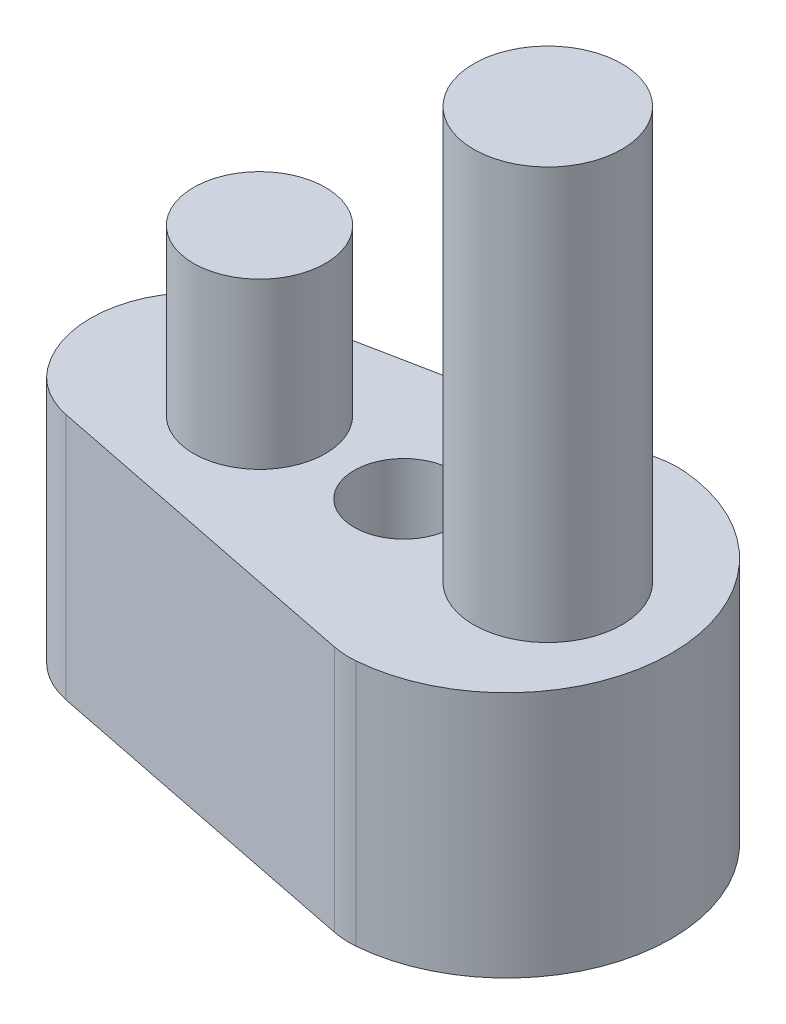
ISO-10303-21;
HEADER;
FILE_DESCRIPTION(('STEP AP214'),'2;1');
FILE_NAME('part.step','',(''),(''),'','','');
FILE_SCHEMA(('AUTOMOTIVE_DESIGN { 1 0 10303 214 1 1 1 1 }'));
ENDSEC;
DATA;
#1=APPLICATION_CONTEXT('core data for automotive mechanical design processes');
#2=APPLICATION_PROTOCOL_DEFINITION('international standard','automotive_design',2000,#1);
#3=PRODUCT_CONTEXT('',#1,'mechanical');
#4=PRODUCT('Part','Part','',(#3));
#5=PRODUCT_RELATED_PRODUCT_CATEGORY('part','',(#4));
#6=PRODUCT_DEFINITION_FORMATION('','',#4);
#7=PRODUCT_DEFINITION_CONTEXT('part definition',#1,'design');
#8=PRODUCT_DEFINITION('design','',#6,#7);
#9=PRODUCT_DEFINITION_SHAPE('','',#8);
#10=(LENGTH_UNIT() NAMED_UNIT(*) SI_UNIT(.MILLI.,.METRE.));
#11=(NAMED_UNIT(*) PLANE_ANGLE_UNIT() SI_UNIT($,.RADIAN.));
#12=(NAMED_UNIT(*) SI_UNIT($,.STERADIAN.) SOLID_ANGLE_UNIT());
#13=UNCERTAINTY_MEASURE_WITH_UNIT(LENGTH_MEASURE(1.E-05),#10,'distance_accuracy_value','');
#14=(GEOMETRIC_REPRESENTATION_CONTEXT(3) GLOBAL_UNCERTAINTY_ASSIGNED_CONTEXT((#13)) GLOBAL_UNIT_ASSIGNED_CONTEXT((#10,
#11,#12)) REPRESENTATION_CONTEXT('',''));
#15=CARTESIAN_POINT('',(0.,0.,0.));
#16=DIRECTION('',(0.,0.,1.));
#17=DIRECTION('',(1.,0.,0.));
#18=AXIS2_PLACEMENT_3D('',#15,#16,#17);
#19=CARTESIAN_POINT('',(0.,3.,0.));
#20=DIRECTION('',(0.,1.,0.));
#21=DIRECTION('',(0.,0.,1.));
#22=AXIS2_PLACEMENT_3D('',#19,#20,#21);
#23=PLANE('',#22);
#24=CARTESIAN_POINT('',(0.5,3.,0.));
#25=DIRECTION('',(0.,1.,0.));
#26=DIRECTION('',(0.,0.,1.));
#27=AXIS2_PLACEMENT_3D('',#24,#25,#26);
#28=CIRCLE('',#27,0.9);
#29=CARTESIAN_POINT('',(0.5,3.,0.9));
#30=VERTEX_POINT('',#29);
#31=EDGE_CURVE('E138',#30,#30,#28,.F.);
#32=ORIENTED_EDGE('',*,*,#31,.T.);
#33=EDGE_LOOP('',(#32));
#34=FACE_BOUND('',#33,.T.);
#35=CARTESIAN_POINT('',(-3.9873014814638,3.,0.183542929297438));
#36=DIRECTION('',(0.,1.,0.));
#37=DIRECTION('',(0.,0.,1.));
#38=AXIS2_PLACEMENT_3D('',#35,#36,#37);
#39=CIRCLE('',#38,1.);
#40=CARTESIAN_POINT('',(-4.183235690524,3.,1.16415997265328));
#41=VERTEX_POINT('',#40);
#42=CARTESIAN_POINT('',(-4.77830641967648,3.,0.795352693622231));
#43=VERTEX_POINT('',#42);
#44=EDGE_CURVE('E156',#41,#43,#39,.F.);
#45=ORIENTED_EDGE('',*,*,#44,.F.);
#46=DIRECTION('',(-0.980617043355843,0.,-0.195934209060197));
#47=VECTOR('',#46,1.);
#48=CARTESIAN_POINT('',(-0.384272849561752,3.,1.92321957143991));
#49=LINE('',#48,#47);
#50=CARTESIAN_POINT('',(-0.113883759971435,3.,1.97724522066388));
#51=VERTEX_POINT('',#50);
#52=EDGE_CURVE('E179',#51,#41,#49,.T.);
#53=ORIENTED_EDGE('',*,*,#52,.F.);
#54=CARTESIAN_POINT('',(0.0820504490887623,3.,0.996628177308034));
#55=DIRECTION('',(0.,1.,0.));
#56=DIRECTION('',(0.,0.,1.));
#57=AXIS2_PLACEMENT_3D('',#54,#55,#56);
#58=CIRCLE('',#57,1.);
#59=CARTESIAN_POINT('',(0.164100898177525,3.,1.99325635461607));
#60=VERTEX_POINT('',#59);
#61=EDGE_CURVE('E168',#51,#60,#58,.T.);
#62=ORIENTED_EDGE('',*,*,#61,.T.);
#63=CARTESIAN_POINT('',(-1.05819487287301E-11,3.,-1.28546370596616E-10));
#64=DIRECTION('',(0.,1.,0.));
#65=DIRECTION('',(0.,0.,1.));
#66=AXIS2_PLACEMENT_3D('',#63,#64,#65);
#67=CIRCLE('',#66,2.00000000012898);
#68=CARTESIAN_POINT('',(0.164100899999999,3.,-1.99325635472312));
#69=VERTEX_POINT('',#68);
#70=EDGE_CURVE('E189',#69,#60,#67,.F.);
#71=ORIENTED_EDGE('',*,*,#70,.F.);
#72=CARTESIAN_POINT('',(0.0820504499999999,3.,-0.996628177490106));
#73=DIRECTION('',(0.,1.,0.));
#74=DIRECTION('',(0.,0.,1.));
#75=AXIS2_PLACEMENT_3D('',#72,#73,#74);
#76=CIRCLE('',#75,1.);
#77=CARTESIAN_POINT('',(-0.113883759060197,3.,-1.97724522084595));
#78=VERTEX_POINT('',#77);
#79=EDGE_CURVE('E114',#69,#78,#76,.T.);
#80=ORIENTED_EDGE('',*,*,#79,.T.);
#81=DIRECTION('',(-0.980617043355843,0.,0.195934209060197));
#82=VECTOR('',#81,1.);
#83=CARTESIAN_POINT('',(-0.384272849561752,3.,-1.92321957143991));
#84=LINE('',#83,#82);
#85=CARTESIAN_POINT('',(-4.183235690524,3.,-1.16415997265328));
#86=VERTEX_POINT('',#85);
#87=EDGE_CURVE('E107',#78,#86,#84,.T.);
#88=ORIENTED_EDGE('',*,*,#87,.T.);
#89=CARTESIAN_POINT('',(-3.9873014814638,3.,-0.183542929297438));
#90=DIRECTION('',(0.,1.,0.));
#91=DIRECTION('',(0.,0.,1.));
#92=AXIS2_PLACEMENT_3D('',#89,#90,#91);
#93=CIRCLE('',#92,1.);
#94=CARTESIAN_POINT('',(-4.77830641967648,3.,-0.795352693622231));
#95=VERTEX_POINT('',#94);
#96=EDGE_CURVE('E111',#86,#95,#93,.T.);
#97=ORIENTED_EDGE('',*,*,#96,.T.);
#98=CARTESIAN_POINT('',(-3.75,3.,0.));
#99=DIRECTION('',(0.,1.,0.));
#100=DIRECTION('',(0.,0.,1.));
#101=AXIS2_PLACEMENT_3D('',#98,#99,#100);
#102=CIRCLE('',#101,1.3);
#103=EDGE_CURVE('E54',#95,#43,#102,.T.);
#104=ORIENTED_EDGE('',*,*,#103,.T.);
#105=EDGE_LOOP('',(#45,#53,#62,#71,#80,#88,#97,#104));
#106=FACE_BOUND('',#105,.T.);
#107=CARTESIAN_POINT('',(-1.24999999999968,3.,0.));
#108=DIRECTION('',(0.,1.,0.));
#109=DIRECTION('',(0.,0.,1.));
#110=AXIS2_PLACEMENT_3D('',#107,#108,#109);
#111=CIRCLE('',#110,0.6);
#112=CARTESIAN_POINT('',(-1.24999999999968,3.,0.599999999999994));
#113=VERTEX_POINT('',#112);
#114=EDGE_CURVE('E128',#113,#113,#111,.T.);
#115=ORIENTED_EDGE('',*,*,#114,.F.);
#116=EDGE_LOOP('',(#115));
#117=FACE_BOUND('',#116,.T.);
#118=CARTESIAN_POINT('',(-3.,3.,0.));
#119=DIRECTION('',(0.,1.,0.));
#120=DIRECTION('',(0.,0.,1.));
#121=AXIS2_PLACEMENT_3D('',#118,#119,#120);
#122=CIRCLE('',#121,0.8);
#123=CARTESIAN_POINT('',(-3.,3.,0.8));
#124=VERTEX_POINT('',#123);
#125=EDGE_CURVE('E337',#124,#124,#122,.F.);
#126=ORIENTED_EDGE('',*,*,#125,.T.);
#127=EDGE_LOOP('',(#126));
#128=FACE_BOUND('',#127,.T.);
#129=ADVANCED_FACE('F37',(#34,#106,#117,#128),#23,.T.);
#130=CARTESIAN_POINT('',(-3.9873014814638,3.,0.183542929297438));
#131=DIRECTION('',(0.,-1.,0.));
#132=DIRECTION('',(0.,0.,-1.));
#133=AXIS2_PLACEMENT_3D('',#130,#131,#132);
#134=CYLINDRICAL_SURFACE('',#133,1.);
#135=CARTESIAN_POINT('',(-3.9873014814638,0.,0.183542929297438));
#136=DIRECTION('',(0.,1.,0.));
#137=DIRECTION('',(0.,0.,1.));
#138=AXIS2_PLACEMENT_3D('',#135,#136,#137);
#139=CIRCLE('',#138,1.);
#140=CARTESIAN_POINT('',(-4.183235690524,0.,1.16415997265328));
#141=VERTEX_POINT('',#140);
#142=CARTESIAN_POINT('',(-4.77830641967648,0.,0.795352693622231));
#143=VERTEX_POINT('',#142);
#144=EDGE_CURVE('E134',#141,#143,#139,.F.);
#145=ORIENTED_EDGE('',*,*,#144,.F.);
#146=DIRECTION('',(0.,-1.,0.));
#147=VECTOR('',#146,1.);
#148=CARTESIAN_POINT('',(-4.183235690524,3.,1.16415997265328));
#149=LINE('',#148,#147);
#150=EDGE_CURVE('E11',#41,#141,#149,.T.);
#151=ORIENTED_EDGE('',*,*,#150,.F.);
#152=ORIENTED_EDGE('',*,*,#44,.T.);
#153=DIRECTION('',(0.,-1.,0.));
#154=VECTOR('',#153,1.);
#155=CARTESIAN_POINT('',(-4.77830641967648,3.,0.795352693622231));
#156=LINE('',#155,#154);
#157=EDGE_CURVE('E89',#43,#143,#156,.T.);
#158=ORIENTED_EDGE('',*,*,#157,.T.);
#159=EDGE_LOOP('',(#145,#151,#152,#158));
#160=FACE_BOUND('',#159,.T.);
#161=ADVANCED_FACE('F39',(#160),#134,.T.);
#162=CARTESIAN_POINT('',(-0.384272849561752,3.,1.92321957143991));
#163=DIRECTION('',(-0.195934209060197,0.,0.980617043355843));
#164=DIRECTION('',(0.980617043355843,0.,0.195934209060197));
#165=AXIS2_PLACEMENT_3D('',#162,#163,#164);
#166=PLANE('',#165);
#167=DIRECTION('',(-0.980617043355843,0.,-0.195934209060197));
#168=VECTOR('',#167,1.);
#169=CARTESIAN_POINT('',(-0.384272849561752,0.,1.92321957143991));
#170=LINE('',#169,#168);
#171=CARTESIAN_POINT('',(-0.113883759971435,0.,1.97724522066388));
#172=VERTEX_POINT('',#171);
#173=EDGE_CURVE('E137',#172,#141,#170,.T.);
#174=ORIENTED_EDGE('',*,*,#173,.F.);
#175=DIRECTION('',(0.,-1.,0.));
#176=VECTOR('',#175,1.);
#177=CARTESIAN_POINT('',(-0.113883759971435,3.,1.97724522066388));
#178=LINE('',#177,#176);
#179=EDGE_CURVE('E46',#51,#172,#178,.T.);
#180=ORIENTED_EDGE('',*,*,#179,.F.);
#181=ORIENTED_EDGE('',*,*,#52,.T.);
#182=ORIENTED_EDGE('',*,*,#150,.T.);
#183=EDGE_LOOP('',(#174,#180,#181,#182));
#184=FACE_BOUND('',#183,.T.);
#185=ADVANCED_FACE('F178',(#184),#166,.T.);
#186=CARTESIAN_POINT('',(0.0820504490887623,3.,0.996628177308034));
#187=DIRECTION('',(0.,-1.,0.));
#188=DIRECTION('',(0.,0.,-1.));
#189=AXIS2_PLACEMENT_3D('',#186,#187,#188);
#190=CYLINDRICAL_SURFACE('',#189,1.);
#191=CARTESIAN_POINT('',(0.0820504490887623,0.,0.996628177308034));
#192=DIRECTION('',(0.,1.,0.));
#193=DIRECTION('',(0.,0.,1.));
#194=AXIS2_PLACEMENT_3D('',#191,#192,#193);
#195=CIRCLE('',#194,1.);
#196=CARTESIAN_POINT('',(0.164100898177525,0.,1.99325635461607));
#197=VERTEX_POINT('',#196);
#198=EDGE_CURVE('E141',#172,#197,#195,.T.);
#199=ORIENTED_EDGE('',*,*,#198,.T.);
#200=DIRECTION('',(0.,-1.,0.));
#201=VECTOR('',#200,1.);
#202=CARTESIAN_POINT('',(0.164100898177525,3.,1.99325635461607));
#203=LINE('',#202,#201);
#204=EDGE_CURVE('E162',#60,#197,#203,.T.);
#205=ORIENTED_EDGE('',*,*,#204,.F.);
#206=ORIENTED_EDGE('',*,*,#61,.F.);
#207=ORIENTED_EDGE('',*,*,#179,.T.);
#208=EDGE_LOOP('',(#199,#205,#206,#207));
#209=FACE_BOUND('',#208,.T.);
#210=ADVANCED_FACE('F166',(#209),#190,.T.);
#211=CARTESIAN_POINT('',(-1.05819487287301E-11,3.,-1.28546370596616E-10));
#212=DIRECTION('',(0.,-1.,0.));
#213=DIRECTION('',(0.,0.,-1.));
#214=AXIS2_PLACEMENT_3D('',#211,#212,#213);
#215=CYLINDRICAL_SURFACE('',#214,2.00000000012898);
#216=CARTESIAN_POINT('',(-1.05819487287301E-11,0.,-1.28546370596616E-10));
#217=DIRECTION('',(0.,1.,0.));
#218=DIRECTION('',(0.,0.,1.));
#219=AXIS2_PLACEMENT_3D('',#216,#217,#218);
#220=CIRCLE('',#219,2.00000000012898);
#221=CARTESIAN_POINT('',(0.164100899999999,0.,-1.99325635472312));
#222=VERTEX_POINT('',#221);
#223=EDGE_CURVE('E144',#222,#197,#220,.F.);
#224=ORIENTED_EDGE('',*,*,#223,.F.);
#225=DIRECTION('',(0.,-1.,0.));
#226=VECTOR('',#225,1.);
#227=CARTESIAN_POINT('',(0.164100899999999,3.,-1.99325635472312));
#228=LINE('',#227,#226);
#229=EDGE_CURVE('E160',#69,#222,#228,.T.);
#230=ORIENTED_EDGE('',*,*,#229,.F.);
#231=ORIENTED_EDGE('',*,*,#70,.T.);
#232=ORIENTED_EDGE('',*,*,#204,.T.);
#233=EDGE_LOOP('',(#224,#230,#231,#232));
#234=FACE_BOUND('',#233,.T.);
#235=ADVANCED_FACE('F192',(#234),#215,.T.);
#236=CARTESIAN_POINT('',(0.0820504499999999,3.,-0.996628177490106));
#237=DIRECTION('',(0.,-1.,0.));
#238=DIRECTION('',(0.,0.,-1.));
#239=AXIS2_PLACEMENT_3D('',#236,#237,#238);
#240=CYLINDRICAL_SURFACE('',#239,1.);
#241=CARTESIAN_POINT('',(0.0820504499999999,0.,-0.996628177490106));
#242=DIRECTION('',(0.,1.,0.));
#243=DIRECTION('',(0.,0.,1.));
#244=AXIS2_PLACEMENT_3D('',#241,#242,#243);
#245=CIRCLE('',#244,1.);
#246=CARTESIAN_POINT('',(-0.113883759060197,0.,-1.97724522084595));
#247=VERTEX_POINT('',#246);
#248=EDGE_CURVE('E147',#222,#247,#245,.T.);
#249=ORIENTED_EDGE('',*,*,#248,.T.);
#250=DIRECTION('',(0.,-1.,0.));
#251=VECTOR('',#250,1.);
#252=CARTESIAN_POINT('',(-0.113883759060197,3.,-1.97724522084595));
#253=LINE('',#252,#251);
#254=EDGE_CURVE('E123',#78,#247,#253,.T.);
#255=ORIENTED_EDGE('',*,*,#254,.F.);
#256=ORIENTED_EDGE('',*,*,#79,.F.);
#257=ORIENTED_EDGE('',*,*,#229,.T.);
#258=EDGE_LOOP('',(#249,#255,#256,#257));
#259=FACE_BOUND('',#258,.T.);
#260=ADVANCED_FACE('F194',(#259),#240,.T.);
#261=CARTESIAN_POINT('',(-0.384272849561752,3.,-1.92321957143991));
#262=DIRECTION('',(0.195934209060197,0.,0.980617043355843));
#263=DIRECTION('',(0.980617043355843,0.,-0.195934209060197));
#264=AXIS2_PLACEMENT_3D('',#261,#262,#263);
#265=PLANE('',#264);
#266=DIRECTION('',(-0.980617043355843,0.,0.195934209060197));
#267=VECTOR('',#266,1.);
#268=CARTESIAN_POINT('',(-0.384272849561752,0.,-1.92321957143991));
#269=LINE('',#268,#267);
#270=CARTESIAN_POINT('',(-4.183235690524,0.,-1.16415997265328));
#271=VERTEX_POINT('',#270);
#272=EDGE_CURVE('E122',#247,#271,#269,.T.);
#273=ORIENTED_EDGE('',*,*,#272,.T.);
#274=DIRECTION('',(0.,-1.,0.));
#275=VECTOR('',#274,1.);
#276=CARTESIAN_POINT('',(-4.183235690524,3.,-1.16415997265328));
#277=LINE('',#276,#275);
#278=EDGE_CURVE('E119',#86,#271,#277,.T.);
#279=ORIENTED_EDGE('',*,*,#278,.F.);
#280=ORIENTED_EDGE('',*,*,#87,.F.);
#281=ORIENTED_EDGE('',*,*,#254,.T.);
#282=EDGE_LOOP('',(#273,#279,#280,#281));
#283=FACE_BOUND('',#282,.T.);
#284=ADVANCED_FACE('F120',(#283),#265,.F.);
#285=CARTESIAN_POINT('',(-3.9873014814638,3.,-0.183542929297438));
#286=DIRECTION('',(0.,-1.,0.));
#287=DIRECTION('',(0.,0.,-1.));
#288=AXIS2_PLACEMENT_3D('',#285,#286,#287);
#289=CYLINDRICAL_SURFACE('',#288,1.);
#290=CARTESIAN_POINT('',(-3.9873014814638,0.,-0.183542929297438));
#291=DIRECTION('',(0.,1.,0.));
#292=DIRECTION('',(0.,0.,1.));
#293=AXIS2_PLACEMENT_3D('',#290,#291,#292);
#294=CIRCLE('',#293,1.);
#295=CARTESIAN_POINT('',(-4.77830641967648,0.,-0.795352693622231));
#296=VERTEX_POINT('',#295);
#297=EDGE_CURVE('E82',#271,#296,#294,.T.);
#298=ORIENTED_EDGE('',*,*,#297,.T.);
#299=DIRECTION('',(0.,-1.,0.));
#300=VECTOR('',#299,1.);
#301=CARTESIAN_POINT('',(-4.77830641967648,3.,-0.795352693622231));
#302=LINE('',#301,#300);
#303=EDGE_CURVE('E124',#95,#296,#302,.T.);
#304=ORIENTED_EDGE('',*,*,#303,.F.);
#305=ORIENTED_EDGE('',*,*,#96,.F.);
#306=ORIENTED_EDGE('',*,*,#278,.T.);
#307=EDGE_LOOP('',(#298,#304,#305,#306));
#308=FACE_BOUND('',#307,.T.);
#309=ADVANCED_FACE('F126',(#308),#289,.T.);
#310=CARTESIAN_POINT('',(-3.75,3.,0.));
#311=DIRECTION('',(0.,-1.,0.));
#312=DIRECTION('',(0.,0.,-1.));
#313=AXIS2_PLACEMENT_3D('',#310,#311,#312);
#314=CYLINDRICAL_SURFACE('',#313,1.3);
#315=CARTESIAN_POINT('',(-3.75,0.,0.));
#316=DIRECTION('',(0.,1.,0.));
#317=DIRECTION('',(0.,0.,1.));
#318=AXIS2_PLACEMENT_3D('',#315,#316,#317);
#319=CIRCLE('',#318,1.3);
#320=EDGE_CURVE('E151',#296,#143,#319,.T.);
#321=ORIENTED_EDGE('',*,*,#320,.T.);
#322=ORIENTED_EDGE('',*,*,#157,.F.);
#323=ORIENTED_EDGE('',*,*,#103,.F.);
#324=ORIENTED_EDGE('',*,*,#303,.T.);
#325=EDGE_LOOP('',(#321,#322,#323,#324));
#326=FACE_BOUND('',#325,.T.);
#327=ADVANCED_FACE('F182',(#326),#314,.T.);
#328=CARTESIAN_POINT('',(-1.24999999999968,3.,0.));
#329=DIRECTION('',(0.,-1.,0.));
#330=DIRECTION('',(0.,0.,-1.));
#331=AXIS2_PLACEMENT_3D('',#328,#329,#330);
#332=CYLINDRICAL_SURFACE('',#331,0.6);
#333=ORIENTED_EDGE('',*,*,#114,.T.);
#334=EDGE_LOOP('',(#333));
#335=FACE_BOUND('',#334,.T.);
#336=CARTESIAN_POINT('',(-1.24999999999968,0.,0.));
#337=DIRECTION('',(0.,1.,0.));
#338=DIRECTION('',(0.,0.,1.));
#339=AXIS2_PLACEMENT_3D('',#336,#337,#338);
#340=CIRCLE('',#339,0.6);
#341=CARTESIAN_POINT('',(-1.24999999999968,0.,0.599999999999994));
#342=VERTEX_POINT('',#341);
#343=EDGE_CURVE('E153',#342,#342,#340,.T.);
#344=ORIENTED_EDGE('',*,*,#343,.F.);
#345=EDGE_LOOP('',(#344));
#346=FACE_BOUND('',#345,.T.);
#347=ADVANCED_FACE('F216',(#335,#346),#332,.F.);
#348=CARTESIAN_POINT('',(0.,0.,0.));
#349=DIRECTION('',(0.,1.,0.));
#350=DIRECTION('',(0.,0.,1.));
#351=AXIS2_PLACEMENT_3D('',#348,#349,#350);
#352=PLANE('',#351);
#353=ORIENTED_EDGE('',*,*,#144,.T.);
#354=ORIENTED_EDGE('',*,*,#320,.F.);
#355=ORIENTED_EDGE('',*,*,#297,.F.);
#356=ORIENTED_EDGE('',*,*,#272,.F.);
#357=ORIENTED_EDGE('',*,*,#248,.F.);
#358=ORIENTED_EDGE('',*,*,#223,.T.);
#359=ORIENTED_EDGE('',*,*,#198,.F.);
#360=ORIENTED_EDGE('',*,*,#173,.T.);
#361=EDGE_LOOP('',(#353,#354,#355,#356,#357,#358,#359,#360));
#362=FACE_BOUND('',#361,.T.);
#363=ORIENTED_EDGE('',*,*,#343,.T.);
#364=EDGE_LOOP('',(#363));
#365=FACE_BOUND('',#364,.T.);
#366=ADVANCED_FACE('F174',(#362,#365),#352,.F.);
#367=CARTESIAN_POINT('',(0.5,8.,0.));
#368=DIRECTION('',(0.,-1.,0.));
#369=DIRECTION('',(0.,0.,-1.));
#370=AXIS2_PLACEMENT_3D('',#367,#368,#369);
#371=CYLINDRICAL_SURFACE('',#370,0.9);
#372=ORIENTED_EDGE('',*,*,#31,.F.);
#373=EDGE_LOOP('',(#372));
#374=FACE_BOUND('',#373,.T.);
#375=CARTESIAN_POINT('',(0.5,8.,0.));
#376=DIRECTION('',(0.,1.,0.));
#377=DIRECTION('',(0.,0.,1.));
#378=AXIS2_PLACEMENT_3D('',#375,#376,#377);
#379=CIRCLE('',#378,0.9);
#380=CARTESIAN_POINT('',(0.5,8.,0.9));
#381=VERTEX_POINT('',#380);
#382=EDGE_CURVE('E340',#381,#381,#379,.T.);
#383=ORIENTED_EDGE('',*,*,#382,.F.);
#384=EDGE_LOOP('',(#383));
#385=FACE_BOUND('',#384,.T.);
#386=ADVANCED_FACE('F212',(#374,#385),#371,.T.);
#387=CARTESIAN_POINT('',(0.,8.,0.));
#388=DIRECTION('',(0.,1.,0.));
#389=DIRECTION('',(0.,0.,1.));
#390=AXIS2_PLACEMENT_3D('',#387,#388,#389);
#391=PLANE('',#390);
#392=ORIENTED_EDGE('',*,*,#382,.T.);
#393=EDGE_LOOP('',(#392));
#394=FACE_BOUND('',#393,.T.);
#395=ADVANCED_FACE('F246',(#394),#391,.T.);
#396=CARTESIAN_POINT('',(-3.,5.,0.));
#397=DIRECTION('',(0.,-1.,0.));
#398=DIRECTION('',(0.,0.,-1.));
#399=AXIS2_PLACEMENT_3D('',#396,#397,#398);
#400=CYLINDRICAL_SURFACE('',#399,0.8);
#401=ORIENTED_EDGE('',*,*,#125,.F.);
#402=EDGE_LOOP('',(#401));
#403=FACE_BOUND('',#402,.T.);
#404=CARTESIAN_POINT('',(-3.,5.,0.));
#405=DIRECTION('',(0.,1.,0.));
#406=DIRECTION('',(0.,0.,1.));
#407=AXIS2_PLACEMENT_3D('',#404,#405,#406);
#408=CIRCLE('',#407,0.8);
#409=CARTESIAN_POINT('',(-3.,5.,0.8));
#410=VERTEX_POINT('',#409);
#411=EDGE_CURVE('E335',#410,#410,#408,.T.);
#412=ORIENTED_EDGE('',*,*,#411,.F.);
#413=EDGE_LOOP('',(#412));
#414=FACE_BOUND('',#413,.T.);
#415=ADVANCED_FACE('F253',(#403,#414),#400,.T.);
#416=CARTESIAN_POINT('',(0.,5.,0.));
#417=DIRECTION('',(0.,1.,0.));
#418=DIRECTION('',(0.,0.,1.));
#419=AXIS2_PLACEMENT_3D('',#416,#417,#418);
#420=PLANE('',#419);
#421=ORIENTED_EDGE('',*,*,#411,.T.);
#422=EDGE_LOOP('',(#421));
#423=FACE_BOUND('',#422,.T.);
#424=ADVANCED_FACE('F259',(#423),#420,.T.);
#425=CLOSED_SHELL('',(#129,#161,#185,#210,#235,#260,#284,#309,#327,#347,#366,#386,#395,#415,#424));
#426=MANIFOLD_SOLID_BREP('B2',#425);
#427=ADVANCED_BREP_SHAPE_REPRESENTATION('',(#18,#426),#14);
#428=SHAPE_DEFINITION_REPRESENTATION(#9,#427);
ENDSEC;
END-ISO-10303-21;
